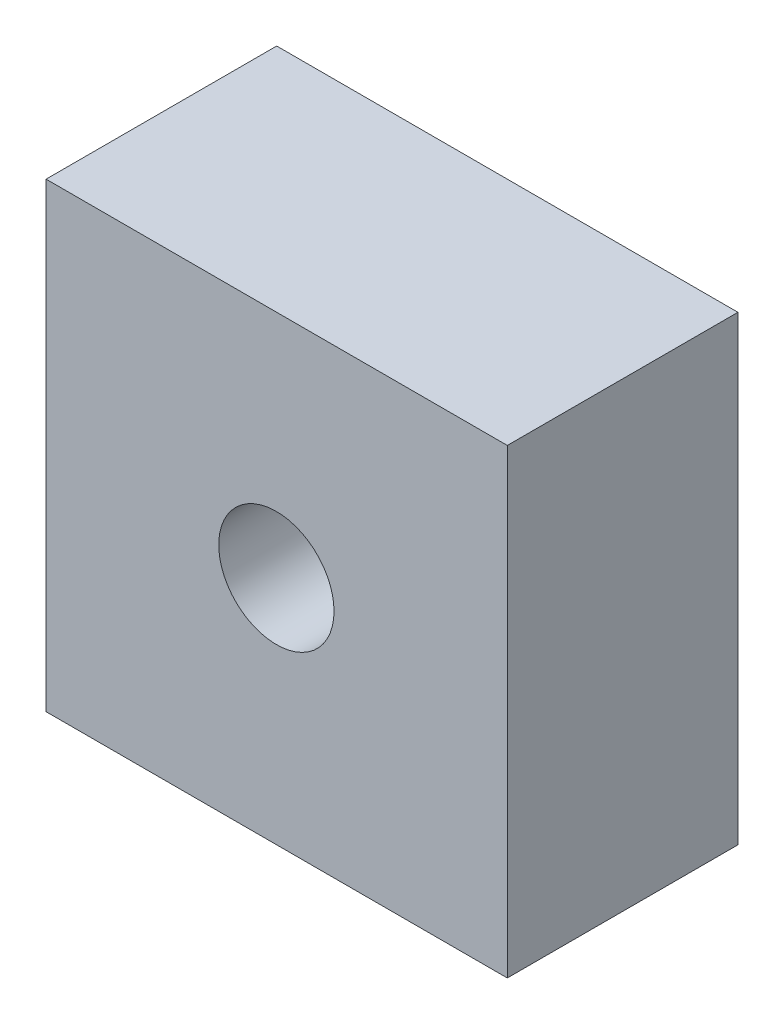
ISO-10303-21;
HEADER;
FILE_DESCRIPTION(('STEP AP214'),'2;1');
FILE_NAME('part.step','',(''),(''),'','','');
FILE_SCHEMA(('AUTOMOTIVE_DESIGN { 1 0 10303 214 1 1 1 1 }'));
ENDSEC;
DATA;
#1=APPLICATION_CONTEXT('core data for automotive mechanical design processes');
#2=APPLICATION_PROTOCOL_DEFINITION('international standard','automotive_design',2000,#1);
#3=PRODUCT_CONTEXT('',#1,'mechanical');
#4=PRODUCT('Part','Part','',(#3));
#5=PRODUCT_RELATED_PRODUCT_CATEGORY('part','',(#4));
#6=PRODUCT_DEFINITION_FORMATION('','',#4);
#7=PRODUCT_DEFINITION_CONTEXT('part definition',#1,'design');
#8=PRODUCT_DEFINITION('design','',#6,#7);
#9=PRODUCT_DEFINITION_SHAPE('','',#8);
#10=(LENGTH_UNIT() NAMED_UNIT(*) SI_UNIT(.MILLI.,.METRE.));
#11=(NAMED_UNIT(*) PLANE_ANGLE_UNIT() SI_UNIT($,.RADIAN.));
#12=(NAMED_UNIT(*) SI_UNIT($,.STERADIAN.) SOLID_ANGLE_UNIT());
#13=UNCERTAINTY_MEASURE_WITH_UNIT(LENGTH_MEASURE(1.E-05),#10,'distance_accuracy_value','');
#14=(GEOMETRIC_REPRESENTATION_CONTEXT(3) GLOBAL_UNCERTAINTY_ASSIGNED_CONTEXT((#13)) GLOBAL_UNIT_ASSIGNED_CONTEXT((#10,
#11,#12)) REPRESENTATION_CONTEXT('',''));
#15=CARTESIAN_POINT('',(0.,0.,0.));
#16=DIRECTION('',(0.,0.,1.));
#17=DIRECTION('',(1.,0.,0.));
#18=AXIS2_PLACEMENT_3D('',#15,#16,#17);
#19=CARTESIAN_POINT('',(0.,0.,10.));
#20=DIRECTION('',(1.,0.,0.));
#21=DIRECTION('',(0.,0.,-1.));
#22=AXIS2_PLACEMENT_3D('',#19,#20,#21);
#23=PLANE('',#22);
#24=DIRECTION('',(0.,-1.,0.));
#25=VECTOR('',#24,1.);
#26=CARTESIAN_POINT('',(0.,0.,0.));
#27=LINE('',#26,#25);
#28=CARTESIAN_POINT('',(0.,20.,0.));
#29=VERTEX_POINT('',#28);
#30=CARTESIAN_POINT('',(0.,0.,0.));
#31=VERTEX_POINT('',#30);
#32=EDGE_CURVE('E107',#29,#31,#27,.T.);
#33=ORIENTED_EDGE('',*,*,#32,.T.);
#34=DIRECTION('',(0.,0.,-1.));
#35=VECTOR('',#34,1.);
#36=CARTESIAN_POINT('',(0.,0.,10.));
#37=LINE('',#36,#35);
#38=CARTESIAN_POINT('',(0.,0.,10.));
#39=VERTEX_POINT('',#38);
#40=EDGE_CURVE('E11',#39,#31,#37,.T.);
#41=ORIENTED_EDGE('',*,*,#40,.F.);
#42=DIRECTION('',(0.,-1.,0.));
#43=VECTOR('',#42,1.);
#44=CARTESIAN_POINT('',(0.,0.,10.));
#45=LINE('',#44,#43);
#46=CARTESIAN_POINT('',(0.,20.,10.));
#47=VERTEX_POINT('',#46);
#48=EDGE_CURVE('E96',#47,#39,#45,.T.);
#49=ORIENTED_EDGE('',*,*,#48,.F.);
#50=DIRECTION('',(0.,0.,-1.));
#51=VECTOR('',#50,1.);
#52=CARTESIAN_POINT('',(0.,20.,10.));
#53=LINE('',#52,#51);
#54=EDGE_CURVE('E102',#47,#29,#53,.T.);
#55=ORIENTED_EDGE('',*,*,#54,.T.);
#56=EDGE_LOOP('',(#33,#41,#49,#55));
#57=FACE_BOUND('',#56,.T.);
#58=ADVANCED_FACE('F44',(#57),#23,.F.);
#59=CARTESIAN_POINT('',(0.,0.,10.));
#60=DIRECTION('',(0.,1.,0.));
#61=DIRECTION('',(0.,0.,1.));
#62=AXIS2_PLACEMENT_3D('',#59,#60,#61);
#63=PLANE('',#62);
#64=DIRECTION('',(1.,0.,0.));
#65=VECTOR('',#64,1.);
#66=CARTESIAN_POINT('',(0.,0.,0.));
#67=LINE('',#66,#65);
#68=CARTESIAN_POINT('',(20.,0.,0.));
#69=VERTEX_POINT('',#68);
#70=EDGE_CURVE('E99',#31,#69,#67,.T.);
#71=ORIENTED_EDGE('',*,*,#70,.T.);
#72=DIRECTION('',(0.,0.,-1.));
#73=VECTOR('',#72,1.);
#74=CARTESIAN_POINT('',(20.,0.,10.));
#75=LINE('',#74,#73);
#76=CARTESIAN_POINT('',(20.,0.,10.));
#77=VERTEX_POINT('',#76);
#78=EDGE_CURVE('E52',#77,#69,#75,.T.);
#79=ORIENTED_EDGE('',*,*,#78,.F.);
#80=DIRECTION('',(1.,0.,0.));
#81=VECTOR('',#80,1.);
#82=CARTESIAN_POINT('',(0.,0.,10.));
#83=LINE('',#82,#81);
#84=EDGE_CURVE('E93',#39,#77,#83,.T.);
#85=ORIENTED_EDGE('',*,*,#84,.F.);
#86=ORIENTED_EDGE('',*,*,#40,.T.);
#87=EDGE_LOOP('',(#71,#79,#85,#86));
#88=FACE_BOUND('',#87,.T.);
#89=ADVANCED_FACE('F97',(#88),#63,.F.);
#90=CARTESIAN_POINT('',(20.,0.,10.));
#91=DIRECTION('',(-1.,0.,0.));
#92=DIRECTION('',(0.,0.,1.));
#93=AXIS2_PLACEMENT_3D('',#90,#91,#92);
#94=PLANE('',#93);
#95=DIRECTION('',(0.,1.,0.));
#96=VECTOR('',#95,1.);
#97=CARTESIAN_POINT('',(20.,0.,0.));
#98=LINE('',#97,#96);
#99=CARTESIAN_POINT('',(20.,20.,0.));
#100=VERTEX_POINT('',#99);
#101=EDGE_CURVE('E77',#69,#100,#98,.T.);
#102=ORIENTED_EDGE('',*,*,#101,.T.);
#103=DIRECTION('',(0.,0.,-1.));
#104=VECTOR('',#103,1.);
#105=CARTESIAN_POINT('',(20.,20.,10.));
#106=LINE('',#105,#104);
#107=CARTESIAN_POINT('',(20.,20.,10.));
#108=VERTEX_POINT('',#107);
#109=EDGE_CURVE('E101',#108,#100,#106,.T.);
#110=ORIENTED_EDGE('',*,*,#109,.F.);
#111=DIRECTION('',(0.,1.,0.));
#112=VECTOR('',#111,1.);
#113=CARTESIAN_POINT('',(20.,0.,10.));
#114=LINE('',#113,#112);
#115=EDGE_CURVE('E94',#77,#108,#114,.T.);
#116=ORIENTED_EDGE('',*,*,#115,.F.);
#117=ORIENTED_EDGE('',*,*,#78,.T.);
#118=EDGE_LOOP('',(#102,#110,#116,#117));
#119=FACE_BOUND('',#118,.T.);
#120=ADVANCED_FACE('F105',(#119),#94,.F.);
#121=CARTESIAN_POINT('',(0.,20.,10.));
#122=DIRECTION('',(0.,-1.,0.));
#123=DIRECTION('',(0.,0.,-1.));
#124=AXIS2_PLACEMENT_3D('',#121,#122,#123);
#125=PLANE('',#124);
#126=DIRECTION('',(-1.,0.,0.));
#127=VECTOR('',#126,1.);
#128=CARTESIAN_POINT('',(0.,20.,0.));
#129=LINE('',#128,#127);
#130=EDGE_CURVE('E83',#100,#29,#129,.T.);
#131=ORIENTED_EDGE('',*,*,#130,.T.);
#132=ORIENTED_EDGE('',*,*,#54,.F.);
#133=DIRECTION('',(-1.,0.,0.));
#134=VECTOR('',#133,1.);
#135=CARTESIAN_POINT('',(0.,20.,10.));
#136=LINE('',#135,#134);
#137=EDGE_CURVE('E63',#108,#47,#136,.T.);
#138=ORIENTED_EDGE('',*,*,#137,.F.);
#139=ORIENTED_EDGE('',*,*,#109,.T.);
#140=EDGE_LOOP('',(#131,#132,#138,#139));
#141=FACE_BOUND('',#140,.T.);
#142=ADVANCED_FACE('F118',(#141),#125,.F.);
#143=CARTESIAN_POINT('',(0.,0.,10.));
#144=DIRECTION('',(0.,0.,-1.));
#145=DIRECTION('',(-1.,0.,0.));
#146=AXIS2_PLACEMENT_3D('',#143,#144,#145);
#147=PLANE('',#146);
#148=CARTESIAN_POINT('',(9.98648737498797,10.0143055988724,10.));
#149=DIRECTION('',(0.,0.,1.));
#150=DIRECTION('',(1.,0.,0.));
#151=AXIS2_PLACEMENT_3D('',#148,#149,#150);
#152=CIRCLE('',#151,2.49999999999999);
#153=CARTESIAN_POINT('',(12.486487374988,10.0143055988724,10.));
#154=VERTEX_POINT('',#153);
#155=EDGE_CURVE('E123',#154,#154,#152,.T.);
#156=ORIENTED_EDGE('',*,*,#155,.F.);
#157=EDGE_LOOP('',(#156));
#158=FACE_BOUND('',#157,.T.);
#159=ORIENTED_EDGE('',*,*,#48,.T.);
#160=ORIENTED_EDGE('',*,*,#84,.T.);
#161=ORIENTED_EDGE('',*,*,#115,.T.);
#162=ORIENTED_EDGE('',*,*,#137,.T.);
#163=EDGE_LOOP('',(#159,#160,#161,#162));
#164=FACE_BOUND('',#163,.T.);
#165=ADVANCED_FACE('F95',(#158,#164),#147,.F.);
#166=CARTESIAN_POINT('',(0.,0.,0.));
#167=DIRECTION('',(0.,0.,-1.));
#168=DIRECTION('',(-1.,0.,0.));
#169=AXIS2_PLACEMENT_3D('',#166,#167,#168);
#170=PLANE('',#169);
#171=CARTESIAN_POINT('',(9.98648737498797,10.0143055988724,0.));
#172=DIRECTION('',(0.,0.,1.));
#173=DIRECTION('',(1.,0.,0.));
#174=AXIS2_PLACEMENT_3D('',#171,#172,#173);
#175=CIRCLE('',#174,2.49999999999999);
#176=CARTESIAN_POINT('',(12.486487374988,10.0143055988724,0.));
#177=VERTEX_POINT('',#176);
#178=EDGE_CURVE('E112',#177,#177,#175,.T.);
#179=ORIENTED_EDGE('',*,*,#178,.T.);
#180=EDGE_LOOP('',(#179));
#181=FACE_BOUND('',#180,.T.);
#182=ORIENTED_EDGE('',*,*,#32,.F.);
#183=ORIENTED_EDGE('',*,*,#130,.F.);
#184=ORIENTED_EDGE('',*,*,#101,.F.);
#185=ORIENTED_EDGE('',*,*,#70,.F.);
#186=EDGE_LOOP('',(#182,#183,#184,#185));
#187=FACE_BOUND('',#186,.T.);
#188=ADVANCED_FACE('F120',(#181,#187),#170,.T.);
#189=CARTESIAN_POINT('',(9.98648737498797,10.0143055988724,10.));
#190=DIRECTION('',(0.,0.,1.));
#191=DIRECTION('',(1.,0.,0.));
#192=AXIS2_PLACEMENT_3D('',#189,#190,#191);
#193=CYLINDRICAL_SURFACE('',#192,2.49999999999999);
#194=ORIENTED_EDGE('',*,*,#178,.F.);
#195=EDGE_LOOP('',(#194));
#196=FACE_BOUND('',#195,.T.);
#197=ORIENTED_EDGE('',*,*,#155,.T.);
#198=EDGE_LOOP('',(#197));
#199=FACE_BOUND('',#198,.T.);
#200=ADVANCED_FACE('F126',(#196,#199),#193,.F.);
#201=CLOSED_SHELL('',(#58,#89,#120,#142,#165,#188,#200));
#202=MANIFOLD_SOLID_BREP('B2',#201);
#203=ADVANCED_BREP_SHAPE_REPRESENTATION('',(#18,#202),#14);
#204=SHAPE_DEFINITION_REPRESENTATION(#9,#203);
ENDSEC;
END-ISO-10303-21;
